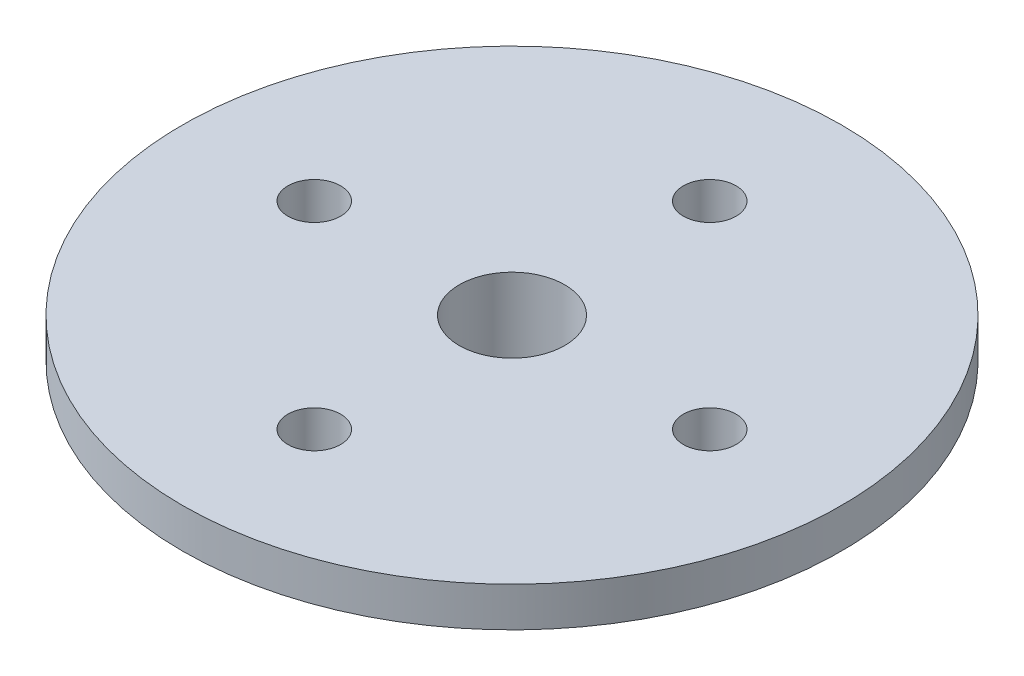
ISO-10303-21;
HEADER;
FILE_DESCRIPTION(('STEP AP214'),'2;1');
FILE_NAME('part.step','',(''),(''),'','','');
FILE_SCHEMA(('AUTOMOTIVE_DESIGN { 1 0 10303 214 1 1 1 1 }'));
ENDSEC;
DATA;
#1=APPLICATION_CONTEXT('core data for automotive mechanical design processes');
#2=APPLICATION_PROTOCOL_DEFINITION('international standard','automotive_design',2000,#1);
#3=PRODUCT_CONTEXT('',#1,'mechanical');
#4=PRODUCT('Part','Part','',(#3));
#5=PRODUCT_RELATED_PRODUCT_CATEGORY('part','',(#4));
#6=PRODUCT_DEFINITION_FORMATION('','',#4);
#7=PRODUCT_DEFINITION_CONTEXT('part definition',#1,'design');
#8=PRODUCT_DEFINITION('design','',#6,#7);
#9=PRODUCT_DEFINITION_SHAPE('','',#8);
#10=(LENGTH_UNIT() NAMED_UNIT(*) SI_UNIT(.MILLI.,.METRE.));
#11=(NAMED_UNIT(*) PLANE_ANGLE_UNIT() SI_UNIT($,.RADIAN.));
#12=(NAMED_UNIT(*) SI_UNIT($,.STERADIAN.) SOLID_ANGLE_UNIT());
#13=UNCERTAINTY_MEASURE_WITH_UNIT(LENGTH_MEASURE(1.E-05),#10,'distance_accuracy_value','');
#14=(GEOMETRIC_REPRESENTATION_CONTEXT(3) GLOBAL_UNCERTAINTY_ASSIGNED_CONTEXT((#13)) GLOBAL_UNIT_ASSIGNED_CONTEXT((#10,
#11,#12)) REPRESENTATION_CONTEXT('',''));
#15=CARTESIAN_POINT('',(0.,0.,0.));
#16=DIRECTION('',(0.,0.,1.));
#17=DIRECTION('',(1.,0.,0.));
#18=AXIS2_PLACEMENT_3D('',#15,#16,#17);
#19=CARTESIAN_POINT('',(0.,3.,0.));
#20=DIRECTION('',(0.,1.,0.));
#21=DIRECTION('',(0.,0.,1.));
#22=AXIS2_PLACEMENT_3D('',#19,#20,#21);
#23=PLANE('',#22);
#24=CARTESIAN_POINT('',(0.,3.,-15.));
#25=DIRECTION('',(0.,1.,0.));
#26=DIRECTION('',(0.,0.,1.));
#27=AXIS2_PLACEMENT_3D('',#24,#25,#26);
#28=CIRCLE('',#27,2.);
#29=CARTESIAN_POINT('',(0.,3.,-13.));
#30=VERTEX_POINT('',#29);
#31=EDGE_CURVE('E64',#30,#30,#28,.T.);
#32=ORIENTED_EDGE('',*,*,#31,.F.);
#33=EDGE_LOOP('',(#32));
#34=FACE_BOUND('',#33,.T.);
#35=CARTESIAN_POINT('',(-14.9999999999995,3.,4.88502961957188E-13));
#36=DIRECTION('',(0.,1.,0.));
#37=DIRECTION('',(0.,0.,1.));
#38=AXIS2_PLACEMENT_3D('',#35,#36,#37);
#39=CIRCLE('',#38,2.);
#40=CARTESIAN_POINT('',(-14.9999999999995,3.,2.00000000000049));
#41=VERTEX_POINT('',#40);
#42=EDGE_CURVE('E65',#41,#41,#39,.T.);
#43=ORIENTED_EDGE('',*,*,#42,.F.);
#44=EDGE_LOOP('',(#43));
#45=FACE_BOUND('',#44,.T.);
#46=CARTESIAN_POINT('',(9.74758708008378E-13,3.,15.));
#47=DIRECTION('',(0.,1.,0.));
#48=DIRECTION('',(0.,0.,1.));
#49=AXIS2_PLACEMENT_3D('',#46,#47,#48);
#50=CIRCLE('',#49,2.);
#51=CARTESIAN_POINT('',(9.74758708008378E-13,3.,17.));
#52=VERTEX_POINT('',#51);
#53=EDGE_CURVE('E71',#52,#52,#50,.T.);
#54=ORIENTED_EDGE('',*,*,#53,.F.);
#55=EDGE_LOOP('',(#54));
#56=FACE_BOUND('',#55,.T.);
#57=CARTESIAN_POINT('',(15.0000000000005,3.,-4.86665991758467E-13));
#58=DIRECTION('',(0.,1.,0.));
#59=DIRECTION('',(0.,0.,1.));
#60=AXIS2_PLACEMENT_3D('',#57,#58,#59);
#61=CIRCLE('',#60,2.);
#62=CARTESIAN_POINT('',(15.0000000000005,3.,1.99999999999951));
#63=VERTEX_POINT('',#62);
#64=EDGE_CURVE('E51',#63,#63,#61,.T.);
#65=ORIENTED_EDGE('',*,*,#64,.F.);
#66=EDGE_LOOP('',(#65));
#67=FACE_BOUND('',#66,.T.);
#68=CARTESIAN_POINT('',(0.,3.,0.));
#69=DIRECTION('',(0.,1.,0.));
#70=DIRECTION('',(0.,0.,1.));
#71=AXIS2_PLACEMENT_3D('',#68,#69,#70);
#72=CIRCLE('',#71,4.);
#73=CARTESIAN_POINT('',(0.,3.,4.));
#74=VERTEX_POINT('',#73);
#75=EDGE_CURVE('E58',#74,#74,#72,.T.);
#76=ORIENTED_EDGE('',*,*,#75,.F.);
#77=EDGE_LOOP('',(#76));
#78=FACE_BOUND('',#77,.T.);
#79=CARTESIAN_POINT('',(0.,3.,0.));
#80=DIRECTION('',(0.,1.,0.));
#81=DIRECTION('',(0.,0.,1.));
#82=AXIS2_PLACEMENT_3D('',#79,#80,#81);
#83=CIRCLE('',#82,25.);
#84=CARTESIAN_POINT('',(0.,3.,25.));
#85=VERTEX_POINT('',#84);
#86=EDGE_CURVE('E10',#85,#85,#83,.T.);
#87=ORIENTED_EDGE('',*,*,#86,.T.);
#88=EDGE_LOOP('',(#87));
#89=FACE_BOUND('',#88,.T.);
#90=ADVANCED_FACE('F31',(#34,#45,#56,#67,#78,#89),#23,.T.);
#91=CARTESIAN_POINT('',(0.,11.2952907535342,0.));
#92=DIRECTION('',(0.,1.,0.));
#93=DIRECTION('',(0.,0.,1.));
#94=AXIS2_PLACEMENT_3D('',#91,#92,#93);
#95=CYLINDRICAL_SURFACE('',#94,25.);
#96=CARTESIAN_POINT('',(0.,0.,0.));
#97=DIRECTION('',(0.,1.,0.));
#98=DIRECTION('',(0.,0.,1.));
#99=AXIS2_PLACEMENT_3D('',#96,#97,#98);
#100=CIRCLE('',#99,25.);
#101=CARTESIAN_POINT('',(0.,0.,25.));
#102=VERTEX_POINT('',#101);
#103=EDGE_CURVE('E37',#102,#102,#100,.T.);
#104=ORIENTED_EDGE('',*,*,#103,.T.);
#105=EDGE_LOOP('',(#104));
#106=FACE_BOUND('',#105,.T.);
#107=ORIENTED_EDGE('',*,*,#86,.F.);
#108=EDGE_LOOP('',(#107));
#109=FACE_BOUND('',#108,.T.);
#110=ADVANCED_FACE('F93',(#106,#109),#95,.T.);
#111=CARTESIAN_POINT('',(-25.,0.,0.));
#112=DIRECTION('',(0.,-1.,0.));
#113=DIRECTION('',(0.,0.,-1.));
#114=AXIS2_PLACEMENT_3D('',#111,#112,#113);
#115=PLANE('',#114);
#116=CARTESIAN_POINT('',(0.,0.,0.));
#117=DIRECTION('',(0.,1.,0.));
#118=DIRECTION('',(0.,0.,1.));
#119=AXIS2_PLACEMENT_3D('',#116,#117,#118);
#120=CIRCLE('',#119,18.5);
#121=CARTESIAN_POINT('',(0.,0.,18.5));
#122=VERTEX_POINT('',#121);
#123=EDGE_CURVE('E41',#122,#122,#120,.T.);
#124=ORIENTED_EDGE('',*,*,#123,.T.);
#125=EDGE_LOOP('',(#124));
#126=FACE_BOUND('',#125,.T.);
#127=ORIENTED_EDGE('',*,*,#103,.F.);
#128=EDGE_LOOP('',(#127));
#129=FACE_BOUND('',#128,.T.);
#130=ADVANCED_FACE('F122',(#126,#129),#115,.T.);
#131=CARTESIAN_POINT('',(0.,11.2952907535342,0.));
#132=DIRECTION('',(0.,1.,0.));
#133=DIRECTION('',(0.,0.,1.));
#134=AXIS2_PLACEMENT_3D('',#131,#132,#133);
#135=CYLINDRICAL_SURFACE('',#134,18.5);
#136=CARTESIAN_POINT('',(0.,-3.,0.));
#137=DIRECTION('',(0.,1.,0.));
#138=DIRECTION('',(0.,0.,1.));
#139=AXIS2_PLACEMENT_3D('',#136,#137,#138);
#140=CIRCLE('',#139,18.5);
#141=CARTESIAN_POINT('',(0.,-3.,18.5));
#142=VERTEX_POINT('',#141);
#143=EDGE_CURVE('E45',#142,#142,#140,.T.);
#144=ORIENTED_EDGE('',*,*,#143,.T.);
#145=EDGE_LOOP('',(#144));
#146=FACE_BOUND('',#145,.T.);
#147=ORIENTED_EDGE('',*,*,#123,.F.);
#148=EDGE_LOOP('',(#147));
#149=FACE_BOUND('',#148,.T.);
#150=ADVANCED_FACE('F114',(#146,#149),#135,.T.);
#151=CARTESIAN_POINT('',(-18.5,-3.,0.));
#152=DIRECTION('',(0.,-1.,0.));
#153=DIRECTION('',(0.,0.,-1.));
#154=AXIS2_PLACEMENT_3D('',#151,#152,#153);
#155=PLANE('',#154);
#156=CARTESIAN_POINT('',(0.,-3.,-15.));
#157=DIRECTION('',(0.,1.,0.));
#158=DIRECTION('',(0.,0.,1.));
#159=AXIS2_PLACEMENT_3D('',#156,#157,#158);
#160=CIRCLE('',#159,2.);
#161=CARTESIAN_POINT('',(0.,-3.,-13.));
#162=VERTEX_POINT('',#161);
#163=EDGE_CURVE('E50',#162,#162,#160,.T.);
#164=ORIENTED_EDGE('',*,*,#163,.T.);
#165=EDGE_LOOP('',(#164));
#166=FACE_BOUND('',#165,.T.);
#167=CARTESIAN_POINT('',(-14.9999999999995,-3.,4.88502961957188E-13));
#168=DIRECTION('',(0.,1.,0.));
#169=DIRECTION('',(0.,0.,1.));
#170=AXIS2_PLACEMENT_3D('',#167,#168,#169);
#171=CIRCLE('',#170,2.);
#172=CARTESIAN_POINT('',(-14.9999999999995,-3.,2.00000000000049));
#173=VERTEX_POINT('',#172);
#174=EDGE_CURVE('E68',#173,#173,#171,.T.);
#175=ORIENTED_EDGE('',*,*,#174,.T.);
#176=EDGE_LOOP('',(#175));
#177=FACE_BOUND('',#176,.T.);
#178=CARTESIAN_POINT('',(9.74758708008378E-13,-3.,15.));
#179=DIRECTION('',(0.,1.,0.));
#180=DIRECTION('',(0.,0.,1.));
#181=AXIS2_PLACEMENT_3D('',#178,#179,#180);
#182=CIRCLE('',#181,2.);
#183=CARTESIAN_POINT('',(9.74758708008378E-13,-3.,17.));
#184=VERTEX_POINT('',#183);
#185=EDGE_CURVE('E55',#184,#184,#182,.T.);
#186=ORIENTED_EDGE('',*,*,#185,.T.);
#187=EDGE_LOOP('',(#186));
#188=FACE_BOUND('',#187,.T.);
#189=CARTESIAN_POINT('',(15.0000000000005,-3.,-4.86665991758467E-13));
#190=DIRECTION('',(0.,1.,0.));
#191=DIRECTION('',(0.,0.,1.));
#192=AXIS2_PLACEMENT_3D('',#189,#190,#191);
#193=CIRCLE('',#192,2.);
#194=CARTESIAN_POINT('',(15.0000000000005,-3.,1.99999999999951));
#195=VERTEX_POINT('',#194);
#196=EDGE_CURVE('E54',#195,#195,#193,.T.);
#197=ORIENTED_EDGE('',*,*,#196,.T.);
#198=EDGE_LOOP('',(#197));
#199=FACE_BOUND('',#198,.T.);
#200=CARTESIAN_POINT('',(0.,-3.,0.));
#201=DIRECTION('',(0.,1.,0.));
#202=DIRECTION('',(0.,0.,1.));
#203=AXIS2_PLACEMENT_3D('',#200,#201,#202);
#204=CIRCLE('',#203,4.);
#205=CARTESIAN_POINT('',(0.,-3.,4.));
#206=VERTEX_POINT('',#205);
#207=EDGE_CURVE('E61',#206,#206,#204,.T.);
#208=ORIENTED_EDGE('',*,*,#207,.T.);
#209=EDGE_LOOP('',(#208));
#210=FACE_BOUND('',#209,.T.);
#211=ORIENTED_EDGE('',*,*,#143,.F.);
#212=EDGE_LOOP('',(#211));
#213=FACE_BOUND('',#212,.T.);
#214=ADVANCED_FACE('F81',(#166,#177,#188,#199,#210,#213),#155,.T.);
#215=CARTESIAN_POINT('',(0.,-3.,0.));
#216=DIRECTION('',(0.,1.,0.));
#217=DIRECTION('',(0.,0.,1.));
#218=AXIS2_PLACEMENT_3D('',#215,#216,#217);
#219=CYLINDRICAL_SURFACE('',#218,4.);
#220=CARTESIAN_POINT('',(0.,-3.,4.));
#221=CARTESIAN_POINT('',(0.,-2.9375,4.));
#222=CARTESIAN_POINT('',(0.,-2.875,4.));
#223=CARTESIAN_POINT('',(0.,-2.75,4.));
#224=CARTESIAN_POINT('',(0.,-2.6875,4.));
#225=CARTESIAN_POINT('',(0.,-2.5625,4.));
#226=CARTESIAN_POINT('',(0.,-2.5,4.));
#227=CARTESIAN_POINT('',(0.,-2.375,4.));
#228=CARTESIAN_POINT('',(0.,-2.3125,4.));
#229=CARTESIAN_POINT('',(0.,-2.1875,4.));
#230=CARTESIAN_POINT('',(0.,-2.125,4.));
#231=CARTESIAN_POINT('',(0.,-2.,4.));
#232=CARTESIAN_POINT('',(0.,-1.9375,4.));
#233=CARTESIAN_POINT('',(0.,-1.8125,4.));
#234=CARTESIAN_POINT('',(0.,-1.75,4.));
#235=CARTESIAN_POINT('',(0.,-1.625,4.));
#236=CARTESIAN_POINT('',(0.,-1.5625,4.));
#237=CARTESIAN_POINT('',(0.,-1.4375,4.));
#238=CARTESIAN_POINT('',(0.,-1.375,4.));
#239=CARTESIAN_POINT('',(0.,-1.25,4.));
#240=CARTESIAN_POINT('',(0.,-1.1875,4.));
#241=CARTESIAN_POINT('',(0.,-1.0625,4.));
#242=CARTESIAN_POINT('',(0.,-1.,4.));
#243=CARTESIAN_POINT('',(0.,-0.875000000000001,4.));
#244=CARTESIAN_POINT('',(0.,-0.812500000000001,4.));
#245=CARTESIAN_POINT('',(0.,-0.687500000000001,4.));
#246=CARTESIAN_POINT('',(0.,-0.625000000000001,4.));
#247=CARTESIAN_POINT('',(0.,-0.5,4.));
#248=CARTESIAN_POINT('',(0.,-0.4375,4.));
#249=CARTESIAN_POINT('',(0.,-0.3125,4.));
#250=CARTESIAN_POINT('',(0.,-0.25,4.));
#251=CARTESIAN_POINT('',(0.,-0.125,4.));
#252=CARTESIAN_POINT('',(0.,-0.0625000000000001,4.));
#253=CARTESIAN_POINT('',(0.,0.0625000000000001,4.));
#254=CARTESIAN_POINT('',(0.,0.125,4.));
#255=CARTESIAN_POINT('',(0.,0.25,4.));
#256=CARTESIAN_POINT('',(0.,0.3125,4.));
#257=CARTESIAN_POINT('',(0.,0.4375,4.));
#258=CARTESIAN_POINT('',(0.,0.5,4.));
#259=CARTESIAN_POINT('',(0.,0.625000000000001,4.));
#260=CARTESIAN_POINT('',(0.,0.687500000000001,4.));
#261=CARTESIAN_POINT('',(0.,0.812500000000001,4.));
#262=CARTESIAN_POINT('',(0.,0.875,4.));
#263=CARTESIAN_POINT('',(0.,1.,4.));
#264=CARTESIAN_POINT('',(0.,1.0625,4.));
#265=CARTESIAN_POINT('',(0.,1.1875,4.));
#266=CARTESIAN_POINT('',(0.,1.25,4.));
#267=CARTESIAN_POINT('',(0.,1.375,4.));
#268=CARTESIAN_POINT('',(0.,1.4375,4.));
#269=CARTESIAN_POINT('',(0.,1.5625,4.));
#270=CARTESIAN_POINT('',(0.,1.625,4.));
#271=CARTESIAN_POINT('',(0.,1.75,4.));
#272=CARTESIAN_POINT('',(0.,1.8125,4.));
#273=CARTESIAN_POINT('',(0.,1.9375,4.));
#274=CARTESIAN_POINT('',(0.,2.,4.));
#275=CARTESIAN_POINT('',(0.,2.125,4.));
#276=CARTESIAN_POINT('',(0.,2.1875,4.));
#277=CARTESIAN_POINT('',(0.,2.3125,4.));
#278=CARTESIAN_POINT('',(0.,2.375,4.));
#279=CARTESIAN_POINT('',(0.,2.5,4.));
#280=CARTESIAN_POINT('',(0.,2.5625,4.));
#281=CARTESIAN_POINT('',(0.,2.6875,4.));
#282=CARTESIAN_POINT('',(0.,2.75,4.));
#283=CARTESIAN_POINT('',(0.,2.875,4.));
#284=CARTESIAN_POINT('',(0.,2.9375,4.));
#285=CARTESIAN_POINT('',(0.,3.,4.));
#286=B_SPLINE_CURVE_WITH_KNOTS('',3,(#220,#221,#222,#223,#224,#225,#226,#227,#228,#229,#230,
#231,#232,#233,#234,#235,#236,#237,#238,#239,#240,#241,#242,#243,#244,#245,#246,#247,#248,#249,
#250,#251,#252,#253,#254,#255,#256,#257,#258,#259,#260,#261,#262,#263,#264,#265,#266,#267,#268,
#269,#270,#271,#272,#273,#274,#275,#276,#277,#278,#279,#280,#281,#282,#283,#284,#285),
.UNSPECIFIED.,.F.,.F.,(4,2,2,2,2,2,2,2,2,2,2,2,2,2,2,2,2,2,2,2,2,2,2,2,2,2,2,2,2,2,2,2,4),(0.,
0.1875,0.375,0.5625,0.750000000000001,0.937500000000001,1.125,1.3125,1.5,1.6875,1.875,2.0625,
2.25,2.4375,2.625,2.8125,3.,3.1875,3.375,3.5625,3.75,3.9375,4.125,4.3125,4.5,4.68750000000001,
4.87500000000001,5.06250000000001,5.25000000000001,5.43750000000001,5.62500000000001,
5.81250000000001,6.00000000000001),.UNSPECIFIED.);
#287=EDGE_CURVE('BSEAM102',#206,#74,#286,.T.);
#288=ORIENTED_EDGE('',*,*,#207,.F.);
#289=ORIENTED_EDGE('',*,*,#75,.T.);
#290=ORIENTED_EDGE('',*,*,#287,.T.);
#291=ORIENTED_EDGE('',*,*,#287,.F.);
#292=EDGE_LOOP('',(#288,#290,#289,#291));
#293=FACE_BOUND('',#292,.T.);
#294=ADVANCED_FACE('F102',(#293),#219,.F.);
#295=CARTESIAN_POINT('',(15.0000000000005,-3.,-4.86665991758467E-13));
#296=DIRECTION('',(0.,1.,0.));
#297=DIRECTION('',(0.,0.,1.));
#298=AXIS2_PLACEMENT_3D('',#295,#296,#297);
#299=CYLINDRICAL_SURFACE('',#298,2.);
#300=CARTESIAN_POINT('',(15.0000000000005,-3.,1.99999999999951));
#301=CARTESIAN_POINT('',(15.0000000000005,-2.9375,1.99999999999951));
#302=CARTESIAN_POINT('',(15.0000000000005,-2.875,1.99999999999951));
#303=CARTESIAN_POINT('',(15.0000000000005,-2.75,1.99999999999951));
#304=CARTESIAN_POINT('',(15.0000000000005,-2.6875,1.99999999999951));
#305=CARTESIAN_POINT('',(15.0000000000005,-2.5625,1.99999999999951));
#306=CARTESIAN_POINT('',(15.0000000000005,-2.5,1.99999999999951));
#307=CARTESIAN_POINT('',(15.0000000000005,-2.375,1.99999999999951));
#308=CARTESIAN_POINT('',(15.0000000000005,-2.3125,1.99999999999951));
#309=CARTESIAN_POINT('',(15.0000000000005,-2.1875,1.99999999999951));
#310=CARTESIAN_POINT('',(15.0000000000005,-2.125,1.99999999999951));
#311=CARTESIAN_POINT('',(15.0000000000005,-2.,1.99999999999951));
#312=CARTESIAN_POINT('',(15.0000000000005,-1.9375,1.99999999999951));
#313=CARTESIAN_POINT('',(15.0000000000005,-1.8125,1.99999999999951));
#314=CARTESIAN_POINT('',(15.0000000000005,-1.75,1.99999999999951));
#315=CARTESIAN_POINT('',(15.0000000000005,-1.625,1.99999999999951));
#316=CARTESIAN_POINT('',(15.0000000000005,-1.5625,1.99999999999951));
#317=CARTESIAN_POINT('',(15.0000000000005,-1.4375,1.99999999999951));
#318=CARTESIAN_POINT('',(15.0000000000005,-1.375,1.99999999999951));
#319=CARTESIAN_POINT('',(15.0000000000005,-1.25,1.99999999999951));
#320=CARTESIAN_POINT('',(15.0000000000005,-1.1875,1.99999999999951));
#321=CARTESIAN_POINT('',(15.0000000000005,-1.0625,1.99999999999951));
#322=CARTESIAN_POINT('',(15.0000000000005,-1.,1.99999999999951));
#323=CARTESIAN_POINT('',(15.0000000000005,-0.875000000000002,1.99999999999951));
#324=CARTESIAN_POINT('',(15.0000000000005,-0.812500000000001,1.99999999999951));
#325=CARTESIAN_POINT('',(15.0000000000005,-0.687500000000001,1.99999999999951));
#326=CARTESIAN_POINT('',(15.0000000000005,-0.625000000000001,1.99999999999951));
#327=CARTESIAN_POINT('',(15.0000000000005,-0.500000000000001,1.99999999999951));
#328=CARTESIAN_POINT('',(15.0000000000005,-0.437500000000001,1.99999999999951));
#329=CARTESIAN_POINT('',(15.0000000000005,-0.312500000000001,1.99999999999951));
#330=CARTESIAN_POINT('',(15.0000000000005,-0.250000000000001,1.99999999999951));
#331=CARTESIAN_POINT('',(15.0000000000005,-0.125000000000001,1.99999999999951));
#332=CARTESIAN_POINT('',(15.0000000000005,-0.0625000000000005,1.99999999999951));
#333=CARTESIAN_POINT('',(15.0000000000005,0.0624999999999996,1.99999999999951));
#334=CARTESIAN_POINT('',(15.0000000000005,0.125,1.99999999999951));
#335=CARTESIAN_POINT('',(15.0000000000005,0.25,1.99999999999951));
#336=CARTESIAN_POINT('',(15.0000000000005,0.3125,1.99999999999951));
#337=CARTESIAN_POINT('',(15.0000000000005,0.4375,1.99999999999951));
#338=CARTESIAN_POINT('',(15.0000000000005,0.5,1.99999999999951));
#339=CARTESIAN_POINT('',(15.0000000000005,0.625,1.99999999999951));
#340=CARTESIAN_POINT('',(15.0000000000005,0.6875,1.99999999999951));
#341=CARTESIAN_POINT('',(15.0000000000005,0.8125,1.99999999999951));
#342=CARTESIAN_POINT('',(15.0000000000005,0.875,1.99999999999951));
#343=CARTESIAN_POINT('',(15.0000000000005,1.,1.99999999999951));
#344=CARTESIAN_POINT('',(15.0000000000005,1.0625,1.99999999999951));
#345=CARTESIAN_POINT('',(15.0000000000005,1.1875,1.99999999999951));
#346=CARTESIAN_POINT('',(15.0000000000005,1.25,1.99999999999951));
#347=CARTESIAN_POINT('',(15.0000000000005,1.375,1.99999999999951));
#348=CARTESIAN_POINT('',(15.0000000000005,1.4375,1.99999999999951));
#349=CARTESIAN_POINT('',(15.0000000000005,1.5625,1.99999999999951));
#350=CARTESIAN_POINT('',(15.0000000000005,1.625,1.99999999999951));
#351=CARTESIAN_POINT('',(15.0000000000005,1.75,1.99999999999951));
#352=CARTESIAN_POINT('',(15.0000000000005,1.8125,1.99999999999951));
#353=CARTESIAN_POINT('',(15.0000000000005,1.9375,1.99999999999951));
#354=CARTESIAN_POINT('',(15.0000000000005,2.,1.99999999999951));
#355=CARTESIAN_POINT('',(15.0000000000005,2.125,1.99999999999951));
#356=CARTESIAN_POINT('',(15.0000000000005,2.1875,1.99999999999951));
#357=CARTESIAN_POINT('',(15.0000000000005,2.3125,1.99999999999951));
#358=CARTESIAN_POINT('',(15.0000000000005,2.375,1.99999999999951));
#359=CARTESIAN_POINT('',(15.0000000000005,2.5,1.99999999999951));
#360=CARTESIAN_POINT('',(15.0000000000005,2.5625,1.99999999999951));
#361=CARTESIAN_POINT('',(15.0000000000005,2.6875,1.99999999999951));
#362=CARTESIAN_POINT('',(15.0000000000005,2.75,1.99999999999951));
#363=CARTESIAN_POINT('',(15.0000000000005,2.875,1.99999999999951));
#364=CARTESIAN_POINT('',(15.0000000000005,2.9375,1.99999999999951));
#365=CARTESIAN_POINT('',(15.0000000000005,3.,1.99999999999951));
#366=B_SPLINE_CURVE_WITH_KNOTS('',3,(#300,#301,#302,#303,#304,#305,#306,#307,#308,#309,#310,
#311,#312,#313,#314,#315,#316,#317,#318,#319,#320,#321,#322,#323,#324,#325,#326,#327,#328,#329,
#330,#331,#332,#333,#334,#335,#336,#337,#338,#339,#340,#341,#342,#343,#344,#345,#346,#347,#348,
#349,#350,#351,#352,#353,#354,#355,#356,#357,#358,#359,#360,#361,#362,#363,#364,#365),
.UNSPECIFIED.,.F.,.F.,(4,2,2,2,2,2,2,2,2,2,2,2,2,2,2,2,2,2,2,2,2,2,2,2,2,2,2,2,2,2,2,2,4),(0.,
0.187500000000001,0.375000000000001,0.562500000000001,0.750000000000001,0.937500000000001,1.125,
1.3125,1.5,1.6875,1.875,2.0625,2.25,2.4375,2.625,2.8125,3.,3.1875,3.375,3.5625,3.75,3.9375,
4.125,4.3125,4.5,4.68750000000001,4.87500000000001,5.06250000000001,5.25000000000001,
5.43750000000001,5.62500000000001,5.81250000000001,6.00000000000001),.UNSPECIFIED.);
#367=EDGE_CURVE('BSEAM104',#195,#63,#366,.T.);
#368=ORIENTED_EDGE('',*,*,#196,.F.);
#369=ORIENTED_EDGE('',*,*,#64,.T.);
#370=ORIENTED_EDGE('',*,*,#367,.T.);
#371=ORIENTED_EDGE('',*,*,#367,.F.);
#372=EDGE_LOOP('',(#368,#370,#369,#371));
#373=FACE_BOUND('',#372,.T.);
#374=ADVANCED_FACE('F104',(#373),#299,.F.);
#375=CARTESIAN_POINT('',(9.74758708008378E-13,-3.,15.));
#376=DIRECTION('',(0.,1.,0.));
#377=DIRECTION('',(0.,0.,1.));
#378=AXIS2_PLACEMENT_3D('',#375,#376,#377);
#379=CYLINDRICAL_SURFACE('',#378,2.);
#380=CARTESIAN_POINT('',(9.74758708008378E-13,-3.,17.));
#381=CARTESIAN_POINT('',(9.74758708008378E-13,-2.9375,17.));
#382=CARTESIAN_POINT('',(9.74758708008378E-13,-2.875,17.));
#383=CARTESIAN_POINT('',(9.74758708008378E-13,-2.75,17.));
#384=CARTESIAN_POINT('',(9.74758708008378E-13,-2.6875,17.));
#385=CARTESIAN_POINT('',(9.74758708008378E-13,-2.5625,17.));
#386=CARTESIAN_POINT('',(9.74758708008378E-13,-2.5,17.));
#387=CARTESIAN_POINT('',(9.74758708008378E-13,-2.375,17.));
#388=CARTESIAN_POINT('',(9.74758708008378E-13,-2.3125,17.));
#389=CARTESIAN_POINT('',(9.74758708008378E-13,-2.1875,17.));
#390=CARTESIAN_POINT('',(9.74758708008378E-13,-2.125,17.));
#391=CARTESIAN_POINT('',(9.74758708008378E-13,-2.,17.));
#392=CARTESIAN_POINT('',(9.74758708008378E-13,-1.9375,17.));
#393=CARTESIAN_POINT('',(9.74758708008378E-13,-1.8125,17.));
#394=CARTESIAN_POINT('',(9.74758708008378E-13,-1.75,17.));
#395=CARTESIAN_POINT('',(9.74758708008378E-13,-1.625,17.));
#396=CARTESIAN_POINT('',(9.74758708008378E-13,-1.5625,17.));
#397=CARTESIAN_POINT('',(9.74758708008378E-13,-1.4375,17.));
#398=CARTESIAN_POINT('',(9.74758708008378E-13,-1.375,17.));
#399=CARTESIAN_POINT('',(9.74758708008378E-13,-1.25,17.));
#400=CARTESIAN_POINT('',(9.74758708008378E-13,-1.1875,17.));
#401=CARTESIAN_POINT('',(9.74758708008378E-13,-1.0625,17.));
#402=CARTESIAN_POINT('',(9.74758708008378E-13,-1.,17.));
#403=CARTESIAN_POINT('',(9.74758708008378E-13,-0.875000000000002,17.));
#404=CARTESIAN_POINT('',(9.74758708008378E-13,-0.812500000000001,17.));
#405=CARTESIAN_POINT('',(9.74758708008378E-13,-0.687500000000001,17.));
#406=CARTESIAN_POINT('',(9.74758708008378E-13,-0.625000000000001,17.));
#407=CARTESIAN_POINT('',(9.74758708008378E-13,-0.500000000000001,17.));
#408=CARTESIAN_POINT('',(9.74758708008378E-13,-0.437500000000001,17.));
#409=CARTESIAN_POINT('',(9.74758708008378E-13,-0.312500000000001,17.));
#410=CARTESIAN_POINT('',(9.74758708008378E-13,-0.250000000000001,17.));
#411=CARTESIAN_POINT('',(9.74758708008378E-13,-0.125000000000001,17.));
#412=CARTESIAN_POINT('',(9.74758708008378E-13,-0.0625000000000005,17.));
#413=CARTESIAN_POINT('',(9.74758708008378E-13,0.0624999999999996,17.));
#414=CARTESIAN_POINT('',(9.74758708008378E-13,0.125,17.));
#415=CARTESIAN_POINT('',(9.74758708008378E-13,0.25,17.));
#416=CARTESIAN_POINT('',(9.74758708008378E-13,0.3125,17.));
#417=CARTESIAN_POINT('',(9.74758708008378E-13,0.4375,17.));
#418=CARTESIAN_POINT('',(9.74758708008378E-13,0.5,17.));
#419=CARTESIAN_POINT('',(9.74758708008378E-13,0.625,17.));
#420=CARTESIAN_POINT('',(9.74758708008378E-13,0.6875,17.));
#421=CARTESIAN_POINT('',(9.74758708008378E-13,0.8125,17.));
#422=CARTESIAN_POINT('',(9.74758708008378E-13,0.875,17.));
#423=CARTESIAN_POINT('',(9.74758708008378E-13,1.,17.));
#424=CARTESIAN_POINT('',(9.74758708008378E-13,1.0625,17.));
#425=CARTESIAN_POINT('',(9.74758708008378E-13,1.1875,17.));
#426=CARTESIAN_POINT('',(9.74758708008378E-13,1.25,17.));
#427=CARTESIAN_POINT('',(9.74758708008378E-13,1.375,17.));
#428=CARTESIAN_POINT('',(9.74758708008378E-13,1.4375,17.));
#429=CARTESIAN_POINT('',(9.74758708008378E-13,1.5625,17.));
#430=CARTESIAN_POINT('',(9.74758708008378E-13,1.625,17.));
#431=CARTESIAN_POINT('',(9.74758708008378E-13,1.75,17.));
#432=CARTESIAN_POINT('',(9.74758708008378E-13,1.8125,17.));
#433=CARTESIAN_POINT('',(9.74758708008378E-13,1.9375,17.));
#434=CARTESIAN_POINT('',(9.74758708008378E-13,2.,17.));
#435=CARTESIAN_POINT('',(9.74758708008378E-13,2.125,17.));
#436=CARTESIAN_POINT('',(9.74758708008378E-13,2.1875,17.));
#437=CARTESIAN_POINT('',(9.74758708008378E-13,2.3125,17.));
#438=CARTESIAN_POINT('',(9.74758708008378E-13,2.375,17.));
#439=CARTESIAN_POINT('',(9.74758708008378E-13,2.5,17.));
#440=CARTESIAN_POINT('',(9.74758708008378E-13,2.5625,17.));
#441=CARTESIAN_POINT('',(9.74758708008378E-13,2.6875,17.));
#442=CARTESIAN_POINT('',(9.74758708008378E-13,2.75,17.));
#443=CARTESIAN_POINT('',(9.74758708008378E-13,2.875,17.));
#444=CARTESIAN_POINT('',(9.74758708008378E-13,2.9375,17.));
#445=CARTESIAN_POINT('',(9.74758708008378E-13,3.,17.));
#446=B_SPLINE_CURVE_WITH_KNOTS('',3,(#380,#381,#382,#383,#384,#385,#386,#387,#388,#389,#390,
#391,#392,#393,#394,#395,#396,#397,#398,#399,#400,#401,#402,#403,#404,#405,#406,#407,#408,#409,
#410,#411,#412,#413,#414,#415,#416,#417,#418,#419,#420,#421,#422,#423,#424,#425,#426,#427,#428,
#429,#430,#431,#432,#433,#434,#435,#436,#437,#438,#439,#440,#441,#442,#443,#444,#445),
.UNSPECIFIED.,.F.,.F.,(4,2,2,2,2,2,2,2,2,2,2,2,2,2,2,2,2,2,2,2,2,2,2,2,2,2,2,2,2,2,2,2,4),(0.,
0.187500000000001,0.375000000000001,0.562500000000001,0.750000000000001,0.937500000000001,1.125,
1.3125,1.5,1.6875,1.875,2.0625,2.25,2.4375,2.625,2.8125,3.,3.1875,3.375,3.5625,3.75,3.9375,
4.125,4.3125,4.5,4.68750000000001,4.87500000000001,5.06250000000001,5.25000000000001,
5.43750000000001,5.62500000000001,5.81250000000001,6.00000000000001),.UNSPECIFIED.);
#447=EDGE_CURVE('BSEAM111',#184,#52,#446,.T.);
#448=ORIENTED_EDGE('',*,*,#185,.F.);
#449=ORIENTED_EDGE('',*,*,#53,.T.);
#450=ORIENTED_EDGE('',*,*,#447,.T.);
#451=ORIENTED_EDGE('',*,*,#447,.F.);
#452=EDGE_LOOP('',(#448,#450,#449,#451));
#453=FACE_BOUND('',#452,.T.);
#454=ADVANCED_FACE('F111',(#453),#379,.F.);
#455=CARTESIAN_POINT('',(-14.9999999999995,-3.,4.88502961957188E-13));
#456=DIRECTION('',(0.,1.,0.));
#457=DIRECTION('',(0.,0.,1.));
#458=AXIS2_PLACEMENT_3D('',#455,#456,#457);
#459=CYLINDRICAL_SURFACE('',#458,2.);
#460=CARTESIAN_POINT('',(-14.9999999999995,-3.,2.00000000000049));
#461=CARTESIAN_POINT('',(-14.9999999999995,-2.9375,2.00000000000049));
#462=CARTESIAN_POINT('',(-14.9999999999995,-2.875,2.00000000000049));
#463=CARTESIAN_POINT('',(-14.9999999999995,-2.75,2.00000000000049));
#464=CARTESIAN_POINT('',(-14.9999999999995,-2.6875,2.00000000000049));
#465=CARTESIAN_POINT('',(-14.9999999999995,-2.5625,2.00000000000049));
#466=CARTESIAN_POINT('',(-14.9999999999995,-2.5,2.00000000000049));
#467=CARTESIAN_POINT('',(-14.9999999999995,-2.375,2.00000000000049));
#468=CARTESIAN_POINT('',(-14.9999999999995,-2.3125,2.00000000000049));
#469=CARTESIAN_POINT('',(-14.9999999999995,-2.1875,2.00000000000049));
#470=CARTESIAN_POINT('',(-14.9999999999995,-2.125,2.00000000000049));
#471=CARTESIAN_POINT('',(-14.9999999999995,-2.,2.00000000000049));
#472=CARTESIAN_POINT('',(-14.9999999999995,-1.9375,2.00000000000049));
#473=CARTESIAN_POINT('',(-14.9999999999995,-1.8125,2.00000000000049));
#474=CARTESIAN_POINT('',(-14.9999999999995,-1.75,2.00000000000049));
#475=CARTESIAN_POINT('',(-14.9999999999995,-1.625,2.00000000000049));
#476=CARTESIAN_POINT('',(-14.9999999999995,-1.5625,2.00000000000049));
#477=CARTESIAN_POINT('',(-14.9999999999995,-1.4375,2.00000000000049));
#478=CARTESIAN_POINT('',(-14.9999999999995,-1.375,2.00000000000049));
#479=CARTESIAN_POINT('',(-14.9999999999995,-1.25,2.00000000000049));
#480=CARTESIAN_POINT('',(-14.9999999999995,-1.1875,2.00000000000049));
#481=CARTESIAN_POINT('',(-14.9999999999995,-1.0625,2.00000000000049));
#482=CARTESIAN_POINT('',(-14.9999999999995,-1.,2.00000000000049));
#483=CARTESIAN_POINT('',(-14.9999999999995,-0.875000000000002,2.00000000000049));
#484=CARTESIAN_POINT('',(-14.9999999999995,-0.812500000000001,2.00000000000049));
#485=CARTESIAN_POINT('',(-14.9999999999995,-0.687500000000001,2.00000000000049));
#486=CARTESIAN_POINT('',(-14.9999999999995,-0.625000000000001,2.00000000000049));
#487=CARTESIAN_POINT('',(-14.9999999999995,-0.500000000000001,2.00000000000049));
#488=CARTESIAN_POINT('',(-14.9999999999995,-0.437500000000001,2.00000000000049));
#489=CARTESIAN_POINT('',(-14.9999999999995,-0.312500000000001,2.00000000000049));
#490=CARTESIAN_POINT('',(-14.9999999999995,-0.250000000000001,2.00000000000049));
#491=CARTESIAN_POINT('',(-14.9999999999995,-0.125000000000001,2.00000000000049));
#492=CARTESIAN_POINT('',(-14.9999999999995,-0.0625000000000005,2.00000000000049));
#493=CARTESIAN_POINT('',(-14.9999999999995,0.0624999999999996,2.00000000000049));
#494=CARTESIAN_POINT('',(-14.9999999999995,0.125,2.00000000000049));
#495=CARTESIAN_POINT('',(-14.9999999999995,0.25,2.00000000000049));
#496=CARTESIAN_POINT('',(-14.9999999999995,0.3125,2.00000000000049));
#497=CARTESIAN_POINT('',(-14.9999999999995,0.4375,2.00000000000049));
#498=CARTESIAN_POINT('',(-14.9999999999995,0.5,2.00000000000049));
#499=CARTESIAN_POINT('',(-14.9999999999995,0.625,2.00000000000049));
#500=CARTESIAN_POINT('',(-14.9999999999995,0.6875,2.00000000000049));
#501=CARTESIAN_POINT('',(-14.9999999999995,0.8125,2.00000000000049));
#502=CARTESIAN_POINT('',(-14.9999999999995,0.875,2.00000000000049));
#503=CARTESIAN_POINT('',(-14.9999999999995,1.,2.00000000000049));
#504=CARTESIAN_POINT('',(-14.9999999999995,1.0625,2.00000000000049));
#505=CARTESIAN_POINT('',(-14.9999999999995,1.1875,2.00000000000049));
#506=CARTESIAN_POINT('',(-14.9999999999995,1.25,2.00000000000049));
#507=CARTESIAN_POINT('',(-14.9999999999995,1.375,2.00000000000049));
#508=CARTESIAN_POINT('',(-14.9999999999995,1.4375,2.00000000000049));
#509=CARTESIAN_POINT('',(-14.9999999999995,1.5625,2.00000000000049));
#510=CARTESIAN_POINT('',(-14.9999999999995,1.625,2.00000000000049));
#511=CARTESIAN_POINT('',(-14.9999999999995,1.75,2.00000000000049));
#512=CARTESIAN_POINT('',(-14.9999999999995,1.8125,2.00000000000049));
#513=CARTESIAN_POINT('',(-14.9999999999995,1.9375,2.00000000000049));
#514=CARTESIAN_POINT('',(-14.9999999999995,2.,2.00000000000049));
#515=CARTESIAN_POINT('',(-14.9999999999995,2.125,2.00000000000049));
#516=CARTESIAN_POINT('',(-14.9999999999995,2.1875,2.00000000000049));
#517=CARTESIAN_POINT('',(-14.9999999999995,2.3125,2.00000000000049));
#518=CARTESIAN_POINT('',(-14.9999999999995,2.375,2.00000000000049));
#519=CARTESIAN_POINT('',(-14.9999999999995,2.5,2.00000000000049));
#520=CARTESIAN_POINT('',(-14.9999999999995,2.5625,2.00000000000049));
#521=CARTESIAN_POINT('',(-14.9999999999995,2.6875,2.00000000000049));
#522=CARTESIAN_POINT('',(-14.9999999999995,2.75,2.00000000000049));
#523=CARTESIAN_POINT('',(-14.9999999999995,2.875,2.00000000000049));
#524=CARTESIAN_POINT('',(-14.9999999999995,2.9375,2.00000000000049));
#525=CARTESIAN_POINT('',(-14.9999999999995,3.,2.00000000000049));
#526=B_SPLINE_CURVE_WITH_KNOTS('',3,(#460,#461,#462,#463,#464,#465,#466,#467,#468,#469,#470,
#471,#472,#473,#474,#475,#476,#477,#478,#479,#480,#481,#482,#483,#484,#485,#486,#487,#488,#489,
#490,#491,#492,#493,#494,#495,#496,#497,#498,#499,#500,#501,#502,#503,#504,#505,#506,#507,#508,
#509,#510,#511,#512,#513,#514,#515,#516,#517,#518,#519,#520,#521,#522,#523,#524,#525),
.UNSPECIFIED.,.F.,.F.,(4,2,2,2,2,2,2,2,2,2,2,2,2,2,2,2,2,2,2,2,2,2,2,2,2,2,2,2,2,2,2,2,4),(0.,
0.187500000000001,0.375000000000001,0.562500000000001,0.750000000000001,0.937500000000001,1.125,
1.3125,1.5,1.6875,1.875,2.0625,2.25,2.4375,2.625,2.8125,3.,3.1875,3.375,3.5625,3.75,3.9375,
4.125,4.3125,4.5,4.68750000000001,4.87500000000001,5.06250000000001,5.25000000000001,
5.43750000000001,5.62500000000001,5.81250000000001,6.00000000000001),.UNSPECIFIED.);
#527=EDGE_CURVE('BSEAM87',#173,#41,#526,.T.);
#528=ORIENTED_EDGE('',*,*,#174,.F.);
#529=ORIENTED_EDGE('',*,*,#42,.T.);
#530=ORIENTED_EDGE('',*,*,#527,.T.);
#531=ORIENTED_EDGE('',*,*,#527,.F.);
#532=EDGE_LOOP('',(#528,#530,#529,#531));
#533=FACE_BOUND('',#532,.T.);
#534=ADVANCED_FACE('F87',(#533),#459,.F.);
#535=CARTESIAN_POINT('',(0.,-3.,-15.));
#536=DIRECTION('',(0.,1.,0.));
#537=DIRECTION('',(0.,0.,1.));
#538=AXIS2_PLACEMENT_3D('',#535,#536,#537);
#539=CYLINDRICAL_SURFACE('',#538,2.);
#540=CARTESIAN_POINT('',(0.,-3.,-13.));
#541=CARTESIAN_POINT('',(0.,-2.9375,-13.));
#542=CARTESIAN_POINT('',(0.,-2.875,-13.));
#543=CARTESIAN_POINT('',(0.,-2.75,-13.));
#544=CARTESIAN_POINT('',(0.,-2.6875,-13.));
#545=CARTESIAN_POINT('',(0.,-2.5625,-13.));
#546=CARTESIAN_POINT('',(0.,-2.5,-13.));
#547=CARTESIAN_POINT('',(0.,-2.375,-13.));
#548=CARTESIAN_POINT('',(0.,-2.3125,-13.));
#549=CARTESIAN_POINT('',(0.,-2.1875,-13.));
#550=CARTESIAN_POINT('',(0.,-2.125,-13.));
#551=CARTESIAN_POINT('',(0.,-2.,-13.));
#552=CARTESIAN_POINT('',(0.,-1.9375,-13.));
#553=CARTESIAN_POINT('',(0.,-1.8125,-13.));
#554=CARTESIAN_POINT('',(0.,-1.75,-13.));
#555=CARTESIAN_POINT('',(0.,-1.625,-13.));
#556=CARTESIAN_POINT('',(0.,-1.5625,-13.));
#557=CARTESIAN_POINT('',(0.,-1.4375,-13.));
#558=CARTESIAN_POINT('',(0.,-1.375,-13.));
#559=CARTESIAN_POINT('',(0.,-1.25,-13.));
#560=CARTESIAN_POINT('',(0.,-1.1875,-13.));
#561=CARTESIAN_POINT('',(0.,-1.0625,-13.));
#562=CARTESIAN_POINT('',(0.,-1.,-13.));
#563=CARTESIAN_POINT('',(0.,-0.875000000000002,-13.));
#564=CARTESIAN_POINT('',(0.,-0.812500000000001,-13.));
#565=CARTESIAN_POINT('',(0.,-0.687500000000001,-13.));
#566=CARTESIAN_POINT('',(0.,-0.625000000000001,-13.));
#567=CARTESIAN_POINT('',(0.,-0.500000000000001,-13.));
#568=CARTESIAN_POINT('',(0.,-0.437500000000001,-13.));
#569=CARTESIAN_POINT('',(0.,-0.312500000000001,-13.));
#570=CARTESIAN_POINT('',(0.,-0.250000000000001,-13.));
#571=CARTESIAN_POINT('',(0.,-0.125000000000001,-13.));
#572=CARTESIAN_POINT('',(0.,-0.0625000000000005,-13.));
#573=CARTESIAN_POINT('',(0.,0.0624999999999996,-13.));
#574=CARTESIAN_POINT('',(0.,0.125,-13.));
#575=CARTESIAN_POINT('',(0.,0.25,-13.));
#576=CARTESIAN_POINT('',(0.,0.3125,-13.));
#577=CARTESIAN_POINT('',(0.,0.4375,-13.));
#578=CARTESIAN_POINT('',(0.,0.5,-13.));
#579=CARTESIAN_POINT('',(0.,0.625,-13.));
#580=CARTESIAN_POINT('',(0.,0.6875,-13.));
#581=CARTESIAN_POINT('',(0.,0.8125,-13.));
#582=CARTESIAN_POINT('',(0.,0.875,-13.));
#583=CARTESIAN_POINT('',(0.,1.,-13.));
#584=CARTESIAN_POINT('',(0.,1.0625,-13.));
#585=CARTESIAN_POINT('',(0.,1.1875,-13.));
#586=CARTESIAN_POINT('',(0.,1.25,-13.));
#587=CARTESIAN_POINT('',(0.,1.375,-13.));
#588=CARTESIAN_POINT('',(0.,1.4375,-13.));
#589=CARTESIAN_POINT('',(0.,1.5625,-13.));
#590=CARTESIAN_POINT('',(0.,1.625,-13.));
#591=CARTESIAN_POINT('',(0.,1.75,-13.));
#592=CARTESIAN_POINT('',(0.,1.8125,-13.));
#593=CARTESIAN_POINT('',(0.,1.9375,-13.));
#594=CARTESIAN_POINT('',(0.,2.,-13.));
#595=CARTESIAN_POINT('',(0.,2.125,-13.));
#596=CARTESIAN_POINT('',(0.,2.1875,-13.));
#597=CARTESIAN_POINT('',(0.,2.3125,-13.));
#598=CARTESIAN_POINT('',(0.,2.375,-13.));
#599=CARTESIAN_POINT('',(0.,2.5,-13.));
#600=CARTESIAN_POINT('',(0.,2.5625,-13.));
#601=CARTESIAN_POINT('',(0.,2.6875,-13.));
#602=CARTESIAN_POINT('',(0.,2.75,-13.));
#603=CARTESIAN_POINT('',(0.,2.875,-13.));
#604=CARTESIAN_POINT('',(0.,2.9375,-13.));
#605=CARTESIAN_POINT('',(0.,3.,-13.));
#606=B_SPLINE_CURVE_WITH_KNOTS('',3,(#540,#541,#542,#543,#544,#545,#546,#547,#548,#549,#550,
#551,#552,#553,#554,#555,#556,#557,#558,#559,#560,#561,#562,#563,#564,#565,#566,#567,#568,#569,
#570,#571,#572,#573,#574,#575,#576,#577,#578,#579,#580,#581,#582,#583,#584,#585,#586,#587,#588,
#589,#590,#591,#592,#593,#594,#595,#596,#597,#598,#599,#600,#601,#602,#603,#604,#605),
.UNSPECIFIED.,.F.,.F.,(4,2,2,2,2,2,2,2,2,2,2,2,2,2,2,2,2,2,2,2,2,2,2,2,2,2,2,2,2,2,2,2,4),(0.,
0.187500000000001,0.375000000000001,0.562500000000001,0.750000000000001,0.937500000000001,1.125,
1.3125,1.5,1.6875,1.875,2.0625,2.25,2.4375,2.625,2.8125,3.,3.1875,3.375,3.5625,3.75,3.9375,
4.125,4.3125,4.5,4.68750000000001,4.87500000000001,5.06250000000001,5.25000000000001,
5.43750000000001,5.62500000000001,5.81250000000001,6.00000000000001),.UNSPECIFIED.);
#607=EDGE_CURVE('BSEAM84',#162,#30,#606,.T.);
#608=ORIENTED_EDGE('',*,*,#163,.F.);
#609=ORIENTED_EDGE('',*,*,#31,.T.);
#610=ORIENTED_EDGE('',*,*,#607,.T.);
#611=ORIENTED_EDGE('',*,*,#607,.F.);
#612=EDGE_LOOP('',(#608,#610,#609,#611));
#613=FACE_BOUND('',#612,.T.);
#614=ADVANCED_FACE('F84',(#613),#539,.F.);
#615=CLOSED_SHELL('',(#90,#110,#130,#150,#214,#294,#374,#454,#534,#614));
#616=MANIFOLD_SOLID_BREP('B2',#615);
#617=ADVANCED_BREP_SHAPE_REPRESENTATION('',(#18,#616),#14);
#618=SHAPE_DEFINITION_REPRESENTATION(#9,#617);
ENDSEC;
END-ISO-10303-21;
